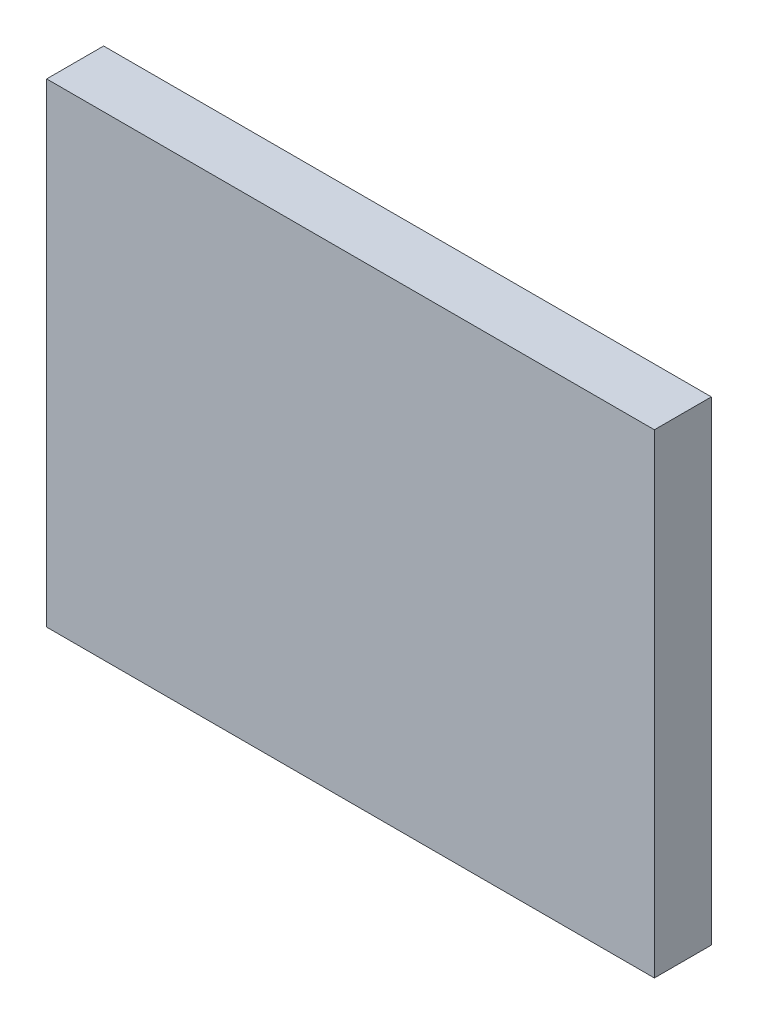
ISO-10303-21;
HEADER;
FILE_DESCRIPTION(('STEP AP214'),'2;1');
FILE_NAME('part.step','',(''),(''),'','','');
FILE_SCHEMA(('AUTOMOTIVE_DESIGN { 1 0 10303 214 1 1 1 1 }'));
ENDSEC;
DATA;
#1=APPLICATION_CONTEXT('core data for automotive mechanical design processes');
#2=APPLICATION_PROTOCOL_DEFINITION('international standard','automotive_design',2000,#1);
#3=PRODUCT_CONTEXT('',#1,'mechanical');
#4=PRODUCT('Part','Part','',(#3));
#5=PRODUCT_RELATED_PRODUCT_CATEGORY('part','',(#4));
#6=PRODUCT_DEFINITION_FORMATION('','',#4);
#7=PRODUCT_DEFINITION_CONTEXT('part definition',#1,'design');
#8=PRODUCT_DEFINITION('design','',#6,#7);
#9=PRODUCT_DEFINITION_SHAPE('','',#8);
#10=(LENGTH_UNIT() NAMED_UNIT(*) SI_UNIT(.MILLI.,.METRE.));
#11=(NAMED_UNIT(*) PLANE_ANGLE_UNIT() SI_UNIT($,.RADIAN.));
#12=(NAMED_UNIT(*) SI_UNIT($,.STERADIAN.) SOLID_ANGLE_UNIT());
#13=UNCERTAINTY_MEASURE_WITH_UNIT(LENGTH_MEASURE(1.E-05),#10,'distance_accuracy_value','');
#14=(GEOMETRIC_REPRESENTATION_CONTEXT(3) GLOBAL_UNCERTAINTY_ASSIGNED_CONTEXT((#13)) GLOBAL_UNIT_ASSIGNED_CONTEXT((#10,
#11,#12)) REPRESENTATION_CONTEXT('',''));
#15=CARTESIAN_POINT('',(0.,0.,0.));
#16=DIRECTION('',(0.,0.,1.));
#17=DIRECTION('',(1.,0.,0.));
#18=AXIS2_PLACEMENT_3D('',#15,#16,#17);
#19=CARTESIAN_POINT('',(101.6,0.,19.05));
#20=DIRECTION('',(-1.,0.,0.));
#21=DIRECTION('',(0.,0.,1.));
#22=AXIS2_PLACEMENT_3D('',#19,#20,#21);
#23=PLANE('',#22);
#24=DIRECTION('',(0.,1.,0.));
#25=VECTOR('',#24,1.);
#26=CARTESIAN_POINT('',(101.6,0.,0.));
#27=LINE('',#26,#25);
#28=CARTESIAN_POINT('',(101.6,-158.75,0.));
#29=VERTEX_POINT('',#28);
#30=CARTESIAN_POINT('',(101.6,0.,0.));
#31=VERTEX_POINT('',#30);
#32=EDGE_CURVE('E96',#29,#31,#27,.T.);
#33=ORIENTED_EDGE('',*,*,#32,.T.);
#34=DIRECTION('',(0.,0.,-1.));
#35=VECTOR('',#34,1.);
#36=CARTESIAN_POINT('',(101.6,0.,19.05));
#37=LINE('',#36,#35);
#38=CARTESIAN_POINT('',(101.6,0.,19.05));
#39=VERTEX_POINT('',#38);
#40=EDGE_CURVE('E11',#39,#31,#37,.T.);
#41=ORIENTED_EDGE('',*,*,#40,.F.);
#42=DIRECTION('',(0.,1.,0.));
#43=VECTOR('',#42,1.);
#44=CARTESIAN_POINT('',(101.6,0.,19.05));
#45=LINE('',#44,#43);
#46=CARTESIAN_POINT('',(101.6,-158.75,19.05));
#47=VERTEX_POINT('',#46);
#48=EDGE_CURVE('E84',#47,#39,#45,.T.);
#49=ORIENTED_EDGE('',*,*,#48,.F.);
#50=DIRECTION('',(0.,0.,-1.));
#51=VECTOR('',#50,1.);
#52=CARTESIAN_POINT('',(101.6,-158.75,19.05));
#53=LINE('',#52,#51);
#54=EDGE_CURVE('E92',#47,#29,#53,.T.);
#55=ORIENTED_EDGE('',*,*,#54,.T.);
#56=EDGE_LOOP('',(#33,#41,#49,#55));
#57=FACE_BOUND('',#56,.T.);
#58=ADVANCED_FACE('F33',(#57),#23,.F.);
#59=CARTESIAN_POINT('',(101.6,0.,19.05));
#60=DIRECTION('',(0.,-1.,0.));
#61=DIRECTION('',(0.,0.,-1.));
#62=AXIS2_PLACEMENT_3D('',#59,#60,#61);
#63=PLANE('',#62);
#64=DIRECTION('',(-1.,0.,0.));
#65=VECTOR('',#64,1.);
#66=CARTESIAN_POINT('',(101.6,0.,0.));
#67=LINE('',#66,#65);
#68=CARTESIAN_POINT('',(-101.6,0.,0.));
#69=VERTEX_POINT('',#68);
#70=EDGE_CURVE('E88',#31,#69,#67,.T.);
#71=ORIENTED_EDGE('',*,*,#70,.T.);
#72=DIRECTION('',(0.,0.,-1.));
#73=VECTOR('',#72,1.);
#74=CARTESIAN_POINT('',(-101.6,0.,19.05));
#75=LINE('',#74,#73);
#76=CARTESIAN_POINT('',(-101.6,0.,19.05));
#77=VERTEX_POINT('',#76);
#78=EDGE_CURVE('E41',#77,#69,#75,.T.);
#79=ORIENTED_EDGE('',*,*,#78,.F.);
#80=DIRECTION('',(-1.,0.,0.));
#81=VECTOR('',#80,1.);
#82=CARTESIAN_POINT('',(101.6,0.,19.05));
#83=LINE('',#82,#81);
#84=EDGE_CURVE('E79',#39,#77,#83,.T.);
#85=ORIENTED_EDGE('',*,*,#84,.F.);
#86=ORIENTED_EDGE('',*,*,#40,.T.);
#87=EDGE_LOOP('',(#71,#79,#85,#86));
#88=FACE_BOUND('',#87,.T.);
#89=ADVANCED_FACE('F87',(#88),#63,.F.);
#90=CARTESIAN_POINT('',(-101.6,0.,19.05));
#91=DIRECTION('',(1.,0.,0.));
#92=DIRECTION('',(0.,0.,-1.));
#93=AXIS2_PLACEMENT_3D('',#90,#91,#92);
#94=PLANE('',#93);
#95=DIRECTION('',(0.,-1.,0.));
#96=VECTOR('',#95,1.);
#97=CARTESIAN_POINT('',(-101.6,0.,0.));
#98=LINE('',#97,#96);
#99=CARTESIAN_POINT('',(-101.6,-158.75,0.));
#100=VERTEX_POINT('',#99);
#101=EDGE_CURVE('E66',#69,#100,#98,.T.);
#102=ORIENTED_EDGE('',*,*,#101,.T.);
#103=DIRECTION('',(0.,0.,-1.));
#104=VECTOR('',#103,1.);
#105=CARTESIAN_POINT('',(-101.6,-158.75,19.05));
#106=LINE('',#105,#104);
#107=CARTESIAN_POINT('',(-101.6,-158.75,19.05));
#108=VERTEX_POINT('',#107);
#109=EDGE_CURVE('E89',#108,#100,#106,.T.);
#110=ORIENTED_EDGE('',*,*,#109,.F.);
#111=DIRECTION('',(0.,-1.,0.));
#112=VECTOR('',#111,1.);
#113=CARTESIAN_POINT('',(-101.6,0.,19.05));
#114=LINE('',#113,#112);
#115=EDGE_CURVE('E82',#77,#108,#114,.T.);
#116=ORIENTED_EDGE('',*,*,#115,.F.);
#117=ORIENTED_EDGE('',*,*,#78,.T.);
#118=EDGE_LOOP('',(#102,#110,#116,#117));
#119=FACE_BOUND('',#118,.T.);
#120=ADVANCED_FACE('F90',(#119),#94,.F.);
#121=CARTESIAN_POINT('',(101.6,-158.75,19.05));
#122=DIRECTION('',(0.,1.,0.));
#123=DIRECTION('',(0.,0.,1.));
#124=AXIS2_PLACEMENT_3D('',#121,#122,#123);
#125=PLANE('',#124);
#126=DIRECTION('',(1.,0.,0.));
#127=VECTOR('',#126,1.);
#128=CARTESIAN_POINT('',(101.6,-158.75,0.));
#129=LINE('',#128,#127);
#130=EDGE_CURVE('E72',#100,#29,#129,.T.);
#131=ORIENTED_EDGE('',*,*,#130,.T.);
#132=ORIENTED_EDGE('',*,*,#54,.F.);
#133=DIRECTION('',(1.,0.,0.));
#134=VECTOR('',#133,1.);
#135=CARTESIAN_POINT('',(101.6,-158.75,19.05));
#136=LINE('',#135,#134);
#137=EDGE_CURVE('E49',#108,#47,#136,.T.);
#138=ORIENTED_EDGE('',*,*,#137,.F.);
#139=ORIENTED_EDGE('',*,*,#109,.T.);
#140=EDGE_LOOP('',(#131,#132,#138,#139));
#141=FACE_BOUND('',#140,.T.);
#142=ADVANCED_FACE('F103',(#141),#125,.F.);
#143=CARTESIAN_POINT('',(0.,0.,19.05));
#144=DIRECTION('',(0.,0.,-1.));
#145=DIRECTION('',(-1.,0.,0.));
#146=AXIS2_PLACEMENT_3D('',#143,#144,#145);
#147=PLANE('',#146);
#148=ORIENTED_EDGE('',*,*,#48,.T.);
#149=ORIENTED_EDGE('',*,*,#84,.T.);
#150=ORIENTED_EDGE('',*,*,#115,.T.);
#151=ORIENTED_EDGE('',*,*,#137,.T.);
#152=EDGE_LOOP('',(#148,#149,#150,#151));
#153=FACE_BOUND('',#152,.T.);
#154=ADVANCED_FACE('F80',(#153),#147,.F.);
#155=CARTESIAN_POINT('',(0.,0.,0.));
#156=DIRECTION('',(0.,0.,-1.));
#157=DIRECTION('',(-1.,0.,0.));
#158=AXIS2_PLACEMENT_3D('',#155,#156,#157);
#159=PLANE('',#158);
#160=ORIENTED_EDGE('',*,*,#32,.F.);
#161=ORIENTED_EDGE('',*,*,#130,.F.);
#162=ORIENTED_EDGE('',*,*,#101,.F.);
#163=ORIENTED_EDGE('',*,*,#70,.F.);
#164=EDGE_LOOP('',(#160,#161,#162,#163));
#165=FACE_BOUND('',#164,.T.);
#166=ADVANCED_FACE('F106',(#165),#159,.T.);
#167=CLOSED_SHELL('',(#58,#89,#120,#142,#154,#166));
#168=MANIFOLD_SOLID_BREP('B2',#167);
#169=ADVANCED_BREP_SHAPE_REPRESENTATION('',(#18,#168),#14);
#170=SHAPE_DEFINITION_REPRESENTATION(#9,#169);
ENDSEC;
END-ISO-10303-21;
